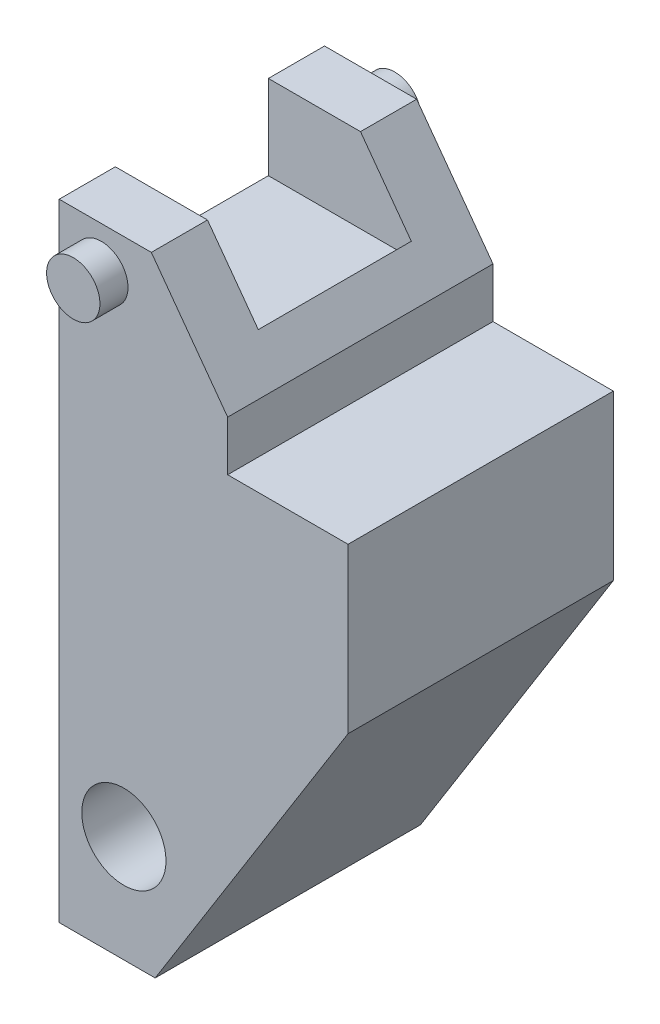
ISO-10303-21;
HEADER;
FILE_DESCRIPTION(('STEP AP214'),'2;1');
FILE_NAME('part.step','',(''),(''),'','','');
FILE_SCHEMA(('AUTOMOTIVE_DESIGN { 1 0 10303 214 1 1 1 1 }'));
ENDSEC;
DATA;
#1=APPLICATION_CONTEXT('core data for automotive mechanical design processes');
#2=APPLICATION_PROTOCOL_DEFINITION('international standard','automotive_design',2000,#1);
#3=PRODUCT_CONTEXT('',#1,'mechanical');
#4=PRODUCT('Part','Part','',(#3));
#5=PRODUCT_RELATED_PRODUCT_CATEGORY('part','',(#4));
#6=PRODUCT_DEFINITION_FORMATION('','',#4);
#7=PRODUCT_DEFINITION_CONTEXT('part definition',#1,'design');
#8=PRODUCT_DEFINITION('design','',#6,#7);
#9=PRODUCT_DEFINITION_SHAPE('','',#8);
#10=(LENGTH_UNIT() NAMED_UNIT(*) SI_UNIT(.MILLI.,.METRE.));
#11=(NAMED_UNIT(*) PLANE_ANGLE_UNIT() SI_UNIT($,.RADIAN.));
#12=(NAMED_UNIT(*) SI_UNIT($,.STERADIAN.) SOLID_ANGLE_UNIT());
#13=UNCERTAINTY_MEASURE_WITH_UNIT(LENGTH_MEASURE(1.E-05),#10,'distance_accuracy_value','');
#14=(GEOMETRIC_REPRESENTATION_CONTEXT(3) GLOBAL_UNCERTAINTY_ASSIGNED_CONTEXT((#13)) GLOBAL_UNIT_ASSIGNED_CONTEXT((#10,
#11,#12)) REPRESENTATION_CONTEXT('',''));
#15=CARTESIAN_POINT('',(0.,0.,0.));
#16=DIRECTION('',(0.,0.,1.));
#17=DIRECTION('',(1.,0.,0.));
#18=AXIS2_PLACEMENT_3D('',#15,#16,#17);
#19=CARTESIAN_POINT('',(3.37816708968153,-9.67384212045168,18.9));
#20=DIRECTION('',(0.,0.,-1.));
#21=DIRECTION('',(-1.,0.,0.));
#22=AXIS2_PLACEMENT_3D('',#19,#20,#21);
#23=CYLINDRICAL_SURFACE('',#22,1.6);
#24=CARTESIAN_POINT('',(3.37816708968153,-9.67384212045168,0.));
#25=DIRECTION('',(0.,0.,1.));
#26=DIRECTION('',(1.,0.,0.));
#27=AXIS2_PLACEMENT_3D('',#24,#25,#26);
#28=CIRCLE('',#27,1.6);
#29=CARTESIAN_POINT('',(4.97816708968153,-9.67384212045168,0.));
#30=VERTEX_POINT('',#29);
#31=EDGE_CURVE('E196',#30,#30,#28,.T.);
#32=ORIENTED_EDGE('',*,*,#31,.F.);
#33=EDGE_LOOP('',(#32));
#34=FACE_BOUND('',#33,.T.);
#35=CARTESIAN_POINT('',(3.37816708968153,-9.67384212045168,12.9));
#36=DIRECTION('',(0.,0.,1.));
#37=DIRECTION('',(1.,0.,0.));
#38=AXIS2_PLACEMENT_3D('',#35,#36,#37);
#39=CIRCLE('',#38,1.6);
#40=CARTESIAN_POINT('',(4.97816708968153,-9.67384212045168,12.9));
#41=VERTEX_POINT('',#40);
#42=EDGE_CURVE('E37',#41,#41,#39,.T.);
#43=ORIENTED_EDGE('',*,*,#42,.T.);
#44=EDGE_LOOP('',(#43));
#45=FACE_BOUND('',#44,.T.);
#46=ADVANCED_FACE('F33',(#34,#45),#23,.F.);
#47=CARTESIAN_POINT('',(8.52526392109153,7.41796568937608,18.9));
#48=DIRECTION('',(0.,0.,-1.));
#49=DIRECTION('',(-1.,0.,0.));
#50=AXIS2_PLACEMENT_3D('',#47,#48,#49);
#51=CYLINDRICAL_SURFACE('',#50,5.1);
#52=CARTESIAN_POINT('',(8.52526392109153,7.41796568937608,0.));
#53=DIRECTION('',(0.,0.,1.));
#54=DIRECTION('',(1.,0.,0.));
#55=AXIS2_PLACEMENT_3D('',#52,#53,#54);
#56=CIRCLE('',#55,5.1);
#57=CARTESIAN_POINT('',(13.6252639210915,7.41796568937608,0.));
#58=VERTEX_POINT('',#57);
#59=EDGE_CURVE('E279',#58,#58,#56,.T.);
#60=ORIENTED_EDGE('',*,*,#59,.F.);
#61=EDGE_LOOP('',(#60));
#62=FACE_BOUND('',#61,.T.);
#63=CARTESIAN_POINT('',(8.52526392109153,7.41796568937608,8.9));
#64=DIRECTION('',(0.,0.,1.));
#65=DIRECTION('',(1.,0.,0.));
#66=AXIS2_PLACEMENT_3D('',#63,#64,#65);
#67=CIRCLE('',#66,5.1);
#68=CARTESIAN_POINT('',(13.6252639210915,7.41796568937608,8.9));
#69=VERTEX_POINT('',#68);
#70=EDGE_CURVE('E219',#69,#69,#67,.T.);
#71=ORIENTED_EDGE('',*,*,#70,.T.);
#72=EDGE_LOOP('',(#71));
#73=FACE_BOUND('',#72,.T.);
#74=ADVANCED_FACE('F298',(#62,#73),#51,.F.);
#75=CARTESIAN_POINT('',(0.,27.3533997750493,0.));
#76=DIRECTION('',(0.,1.,0.));
#77=DIRECTION('',(0.,0.,1.));
#78=AXIS2_PLACEMENT_3D('',#75,#76,#77);
#79=PLANE('',#78);
#80=DIRECTION('',(-1.,0.,0.));
#81=VECTOR('',#80,1.);
#82=CARTESIAN_POINT('',(-1.22842439624783,27.3533997750493,4.));
#83=LINE('',#82,#81);
#84=CARTESIAN_POINT('',(5.33432198728612,27.3533997750493,4.));
#85=VERTEX_POINT('',#84);
#86=CARTESIAN_POINT('',(-1.22842439624783,27.3533997750493,4.));
#87=VERTEX_POINT('',#86);
#88=EDGE_CURVE('E149',#85,#87,#83,.T.);
#89=ORIENTED_EDGE('',*,*,#88,.F.);
#90=DIRECTION('',(0.,0.,1.));
#91=VECTOR('',#90,1.);
#92=CARTESIAN_POINT('',(5.33432198728612,27.3533997750493,0.));
#93=LINE('',#92,#91);
#94=CARTESIAN_POINT('',(5.33432198728612,27.3533997750493,0.));
#95=VERTEX_POINT('',#94);
#96=EDGE_CURVE('E213',#95,#85,#93,.T.);
#97=ORIENTED_EDGE('',*,*,#96,.F.);
#98=DIRECTION('',(-1.,0.,0.));
#99=VECTOR('',#98,1.);
#100=CARTESIAN_POINT('',(-1.22842439624783,27.3533997750493,0.));
#101=LINE('',#100,#99);
#102=CARTESIAN_POINT('',(-1.22842439624783,27.3533997750493,0.));
#103=VERTEX_POINT('',#102);
#104=EDGE_CURVE('E191',#95,#103,#101,.T.);
#105=ORIENTED_EDGE('',*,*,#104,.T.);
#106=DIRECTION('',(0.,0.,1.));
#107=VECTOR('',#106,1.);
#108=CARTESIAN_POINT('',(-1.22842439624783,27.3533997750493,0.));
#109=LINE('',#108,#107);
#110=EDGE_CURVE('E185',#103,#87,#109,.T.);
#111=ORIENTED_EDGE('',*,*,#110,.T.);
#112=EDGE_LOOP('',(#89,#97,#105,#111));
#113=FACE_BOUND('',#112,.T.);
#114=ADVANCED_FACE('F305',(#113),#79,.T.);
#115=CARTESIAN_POINT('',(0.,0.,0.));
#116=DIRECTION('',(0.,0.,1.));
#117=DIRECTION('',(1.,0.,0.));
#118=AXIS2_PLACEMENT_3D('',#115,#116,#117);
#119=PLANE('',#118);
#120=ORIENTED_EDGE('',*,*,#31,.T.);
#121=EDGE_LOOP('',(#120));
#122=FACE_BOUND('',#121,.T.);
#123=ORIENTED_EDGE('',*,*,#104,.F.);
#124=DIRECTION('',(0.589790976494168,-0.807555944839771,0.));
#125=VECTOR('',#124,1.);
#126=CARTESIAN_POINT('',(16.5068891188945,12.05565300401,0.));
#127=LINE('',#126,#125);
#128=CARTESIAN_POINT('',(10.7715756037522,19.9085817690516,0.));
#129=VERTEX_POINT('',#128);
#130=EDGE_CURVE('E58',#95,#129,#127,.T.);
#131=ORIENTED_EDGE('',*,*,#130,.T.);
#132=DIRECTION('',(0.,-1.,0.));
#133=VECTOR('',#132,1.);
#134=CARTESIAN_POINT('',(10.7715756037522,27.3533997750493,0.));
#135=LINE('',#134,#133);
#136=CARTESIAN_POINT('',(10.7715756037522,16.3533997750493,0.));
#137=VERTEX_POINT('',#136);
#138=EDGE_CURVE('E193',#129,#137,#135,.T.);
#139=ORIENTED_EDGE('',*,*,#138,.T.);
#140=DIRECTION('',(-1.,0.,0.));
#141=VECTOR('',#140,1.);
#142=CARTESIAN_POINT('',(-1.22842439624783,16.3533997750493,0.));
#143=LINE('',#142,#141);
#144=CARTESIAN_POINT('',(19.3476842409033,16.3533997750493,0.));
#145=VERTEX_POINT('',#144);
#146=EDGE_CURVE('E269',#145,#137,#143,.T.);
#147=ORIENTED_EDGE('',*,*,#146,.F.);
#148=DIRECTION('',(0.,1.,0.));
#149=VECTOR('',#148,1.);
#150=CARTESIAN_POINT('',(19.3476842409033,16.3533997750493,0.));
#151=LINE('',#150,#149);
#152=CARTESIAN_POINT('',(19.3476842409033,4.66607576400252,0.));
#153=VERTEX_POINT('',#152);
#154=EDGE_CURVE('E272',#153,#145,#151,.T.);
#155=ORIENTED_EDGE('',*,*,#154,.F.);
#156=DIRECTION('',(-0.530772678386404,-0.847514226357601,0.));
#157=VECTOR('',#156,1.);
#158=CARTESIAN_POINT('',(11.7980863060379,-7.38878672916514,0.));
#159=LINE('',#158,#157);
#160=CARTESIAN_POINT('',(5.60682473883522,-17.2747180722351,0.));
#161=VERTEX_POINT('',#160);
#162=EDGE_CURVE('E172',#153,#161,#159,.T.);
#163=ORIENTED_EDGE('',*,*,#162,.T.);
#164=DIRECTION('',(1.,0.,0.));
#165=VECTOR('',#164,1.);
#166=CARTESIAN_POINT('',(-1.22842439624783,-17.2747180722351,0.));
#167=LINE('',#166,#165);
#168=CARTESIAN_POINT('',(-1.22842439624783,-17.2747180722351,0.));
#169=VERTEX_POINT('',#168);
#170=EDGE_CURVE('E276',#169,#161,#167,.T.);
#171=ORIENTED_EDGE('',*,*,#170,.F.);
#172=DIRECTION('',(0.,-1.,0.));
#173=VECTOR('',#172,1.);
#174=CARTESIAN_POINT('',(-1.22842439624783,16.3533997750493,0.));
#175=LINE('',#174,#173);
#176=EDGE_CURVE('E278',#103,#169,#175,.T.);
#177=ORIENTED_EDGE('',*,*,#176,.F.);
#178=EDGE_LOOP('',(#123,#131,#139,#147,#155,#163,#171,#177));
#179=FACE_BOUND('',#178,.T.);
#180=ORIENTED_EDGE('',*,*,#59,.T.);
#181=EDGE_LOOP('',(#180));
#182=FACE_BOUND('',#181,.T.);
#183=CARTESIAN_POINT('',(1.77157560375217,24.3533997750493,0.));
#184=DIRECTION('',(0.,0.,1.));
#185=DIRECTION('',(1.,0.,0.));
#186=AXIS2_PLACEMENT_3D('',#183,#184,#185);
#187=CIRCLE('',#186,1.9);
#188=CARTESIAN_POINT('',(3.67157560375217,24.3533997750493,0.));
#189=VERTEX_POINT('',#188);
#190=EDGE_CURVE('E251',#189,#189,#187,.F.);
#191=ORIENTED_EDGE('',*,*,#190,.F.);
#192=EDGE_LOOP('',(#191));
#193=FACE_BOUND('',#192,.T.);
#194=ADVANCED_FACE('F294',(#122,#179,#182,#193),#119,.F.);
#195=CARTESIAN_POINT('',(0.,0.,18.9));
#196=DIRECTION('',(0.,0.,1.));
#197=DIRECTION('',(1.,0.,0.));
#198=AXIS2_PLACEMENT_3D('',#195,#196,#197);
#199=PLANE('',#198);
#200=CARTESIAN_POINT('',(3.37816708968153,-9.67384212045168,18.9));
#201=DIRECTION('',(0.,0.,1.));
#202=DIRECTION('',(1.,0.,0.));
#203=AXIS2_PLACEMENT_3D('',#200,#201,#202);
#204=CIRCLE('',#203,3.);
#205=CARTESIAN_POINT('',(6.37816708968153,-9.67384212045168,18.9));
#206=VERTEX_POINT('',#205);
#207=EDGE_CURVE('E229',#206,#206,#204,.T.);
#208=ORIENTED_EDGE('',*,*,#207,.F.);
#209=EDGE_LOOP('',(#208));
#210=FACE_BOUND('',#209,.T.);
#211=DIRECTION('',(0.589790976494168,-0.807555944839771,0.));
#212=VECTOR('',#211,1.);
#213=CARTESIAN_POINT('',(5.33432198728612,27.3533997750493,18.9));
#214=LINE('',#213,#212);
#215=CARTESIAN_POINT('',(5.33432198728612,27.3533997750493,18.9));
#216=VERTEX_POINT('',#215);
#217=CARTESIAN_POINT('',(10.7715756037522,19.9085817690516,18.9));
#218=VERTEX_POINT('',#217);
#219=EDGE_CURVE('E160',#216,#218,#214,.T.);
#220=ORIENTED_EDGE('',*,*,#219,.F.);
#221=DIRECTION('',(1.,0.,0.));
#222=VECTOR('',#221,1.);
#223=CARTESIAN_POINT('',(-1.22842439624783,27.3533997750493,18.9));
#224=LINE('',#223,#222);
#225=CARTESIAN_POINT('',(-1.22842439624783,27.3533997750493,18.9));
#226=VERTEX_POINT('',#225);
#227=EDGE_CURVE('E188',#226,#216,#224,.T.);
#228=ORIENTED_EDGE('',*,*,#227,.F.);
#229=DIRECTION('',(0.,-1.,0.));
#230=VECTOR('',#229,1.);
#231=CARTESIAN_POINT('',(-1.22842439624783,16.3533997750493,18.9));
#232=LINE('',#231,#230);
#233=CARTESIAN_POINT('',(-1.22842439624783,-17.2747180722351,18.9));
#234=VERTEX_POINT('',#233);
#235=EDGE_CURVE('E271',#226,#234,#232,.T.);
#236=ORIENTED_EDGE('',*,*,#235,.T.);
#237=DIRECTION('',(1.,0.,0.));
#238=VECTOR('',#237,1.);
#239=CARTESIAN_POINT('',(-1.22842439624783,-17.2747180722351,18.9));
#240=LINE('',#239,#238);
#241=CARTESIAN_POINT('',(5.60682473883522,-17.2747180722351,18.9));
#242=VERTEX_POINT('',#241);
#243=EDGE_CURVE('E284',#234,#242,#240,.T.);
#244=ORIENTED_EDGE('',*,*,#243,.T.);
#245=DIRECTION('',(-0.530772678386404,-0.847514226357601,0.));
#246=VECTOR('',#245,1.);
#247=CARTESIAN_POINT('',(5.60682473883522,-17.2747180722351,18.9));
#248=LINE('',#247,#246);
#249=CARTESIAN_POINT('',(19.3476842409033,4.66607576400252,18.9));
#250=VERTEX_POINT('',#249);
#251=EDGE_CURVE('E167',#250,#242,#248,.T.);
#252=ORIENTED_EDGE('',*,*,#251,.F.);
#253=DIRECTION('',(0.,1.,0.));
#254=VECTOR('',#253,1.);
#255=CARTESIAN_POINT('',(19.3476842409033,16.3533997750493,18.9));
#256=LINE('',#255,#254);
#257=CARTESIAN_POINT('',(19.3476842409033,16.3533997750493,18.9));
#258=VERTEX_POINT('',#257);
#259=EDGE_CURVE('E282',#250,#258,#256,.T.);
#260=ORIENTED_EDGE('',*,*,#259,.T.);
#261=DIRECTION('',(-1.,0.,0.));
#262=VECTOR('',#261,1.);
#263=CARTESIAN_POINT('',(-1.22842439624783,16.3533997750493,18.9));
#264=LINE('',#263,#262);
#265=CARTESIAN_POINT('',(10.7715756037522,16.3533997750493,18.9));
#266=VERTEX_POINT('',#265);
#267=EDGE_CURVE('E202',#258,#266,#264,.T.);
#268=ORIENTED_EDGE('',*,*,#267,.T.);
#269=DIRECTION('',(0.,-1.,0.));
#270=VECTOR('',#269,1.);
#271=CARTESIAN_POINT('',(10.7715756037522,27.3533997750493,18.9));
#272=LINE('',#271,#270);
#273=EDGE_CURVE('E212',#218,#266,#272,.T.);
#274=ORIENTED_EDGE('',*,*,#273,.F.);
#275=EDGE_LOOP('',(#220,#228,#236,#244,#252,#260,#268,#274));
#276=FACE_BOUND('',#275,.T.);
#277=CARTESIAN_POINT('',(1.77157560375217,24.3533997750493,18.9));
#278=DIRECTION('',(0.,0.,1.));
#279=DIRECTION('',(1.,0.,0.));
#280=AXIS2_PLACEMENT_3D('',#277,#278,#279);
#281=CIRCLE('',#280,1.9);
#282=CARTESIAN_POINT('',(3.67157560375217,24.3533997750493,18.9));
#283=VERTEX_POINT('',#282);
#284=EDGE_CURVE('E178',#283,#283,#281,.T.);
#285=ORIENTED_EDGE('',*,*,#284,.F.);
#286=EDGE_LOOP('',(#285));
#287=FACE_BOUND('',#286,.T.);
#288=ADVANCED_FACE('F312',(#210,#276,#287),#199,.T.);
#289=CARTESIAN_POINT('',(-1.22842439624783,16.3533997750493,18.9));
#290=DIRECTION('',(0.,-1.,0.));
#291=DIRECTION('',(0.,0.,-1.));
#292=AXIS2_PLACEMENT_3D('',#289,#290,#291);
#293=PLANE('',#292);
#294=DIRECTION('',(0.,0.,-1.));
#295=VECTOR('',#294,1.);
#296=CARTESIAN_POINT('',(10.7715756037522,16.3533997750493,0.));
#297=LINE('',#296,#295);
#298=EDGE_CURVE('E182',#266,#137,#297,.T.);
#299=ORIENTED_EDGE('',*,*,#298,.F.);
#300=ORIENTED_EDGE('',*,*,#267,.F.);
#301=DIRECTION('',(0.,0.,-1.));
#302=VECTOR('',#301,1.);
#303=CARTESIAN_POINT('',(19.3476842409033,16.3533997750493,18.9));
#304=LINE('',#303,#302);
#305=EDGE_CURVE('E260',#258,#145,#304,.T.);
#306=ORIENTED_EDGE('',*,*,#305,.T.);
#307=ORIENTED_EDGE('',*,*,#146,.T.);
#308=EDGE_LOOP('',(#299,#300,#306,#307));
#309=FACE_BOUND('',#308,.T.);
#310=ADVANCED_FACE('F314',(#309),#293,.F.);
#311=CARTESIAN_POINT('',(-1.22842439624783,16.3533997750493,18.9));
#312=DIRECTION('',(1.,0.,0.));
#313=DIRECTION('',(0.,0.,-1.));
#314=AXIS2_PLACEMENT_3D('',#311,#312,#313);
#315=PLANE('',#314);
#316=DIRECTION('',(0.,0.,1.));
#317=VECTOR('',#316,1.);
#318=CARTESIAN_POINT('',(-1.22842439624783,21.3533997750493,14.9));
#319=LINE('',#318,#317);
#320=CARTESIAN_POINT('',(-1.22842439624783,21.3533997750493,4.));
#321=VERTEX_POINT('',#320);
#322=CARTESIAN_POINT('',(-1.22842439624783,21.3533997750493,14.9));
#323=VERTEX_POINT('',#322);
#324=EDGE_CURVE('E140',#321,#323,#319,.T.);
#325=ORIENTED_EDGE('',*,*,#324,.F.);
#326=DIRECTION('',(0.,1.,0.));
#327=VECTOR('',#326,1.);
#328=CARTESIAN_POINT('',(-1.22842439624783,21.3533997750493,4.));
#329=LINE('',#328,#327);
#330=EDGE_CURVE('E163',#321,#87,#329,.T.);
#331=ORIENTED_EDGE('',*,*,#330,.T.);
#332=ORIENTED_EDGE('',*,*,#110,.F.);
#333=ORIENTED_EDGE('',*,*,#176,.T.);
#334=DIRECTION('',(0.,0.,-1.));
#335=VECTOR('',#334,1.);
#336=CARTESIAN_POINT('',(-1.22842439624783,-17.2747180722351,18.9));
#337=LINE('',#336,#335);
#338=EDGE_CURVE('E256',#234,#169,#337,.T.);
#339=ORIENTED_EDGE('',*,*,#338,.F.);
#340=ORIENTED_EDGE('',*,*,#235,.F.);
#341=CARTESIAN_POINT('',(-1.22842439624783,27.3533997750493,14.9));
#342=VERTEX_POINT('',#341);
#343=EDGE_CURVE('E153',#342,#226,#109,.T.);
#344=ORIENTED_EDGE('',*,*,#343,.F.);
#345=DIRECTION('',(0.,1.,0.));
#346=VECTOR('',#345,1.);
#347=CARTESIAN_POINT('',(-1.22842439624783,21.3533997750493,14.9));
#348=LINE('',#347,#346);
#349=EDGE_CURVE('E133',#323,#342,#348,.T.);
#350=ORIENTED_EDGE('',*,*,#349,.F.);
#351=EDGE_LOOP('',(#325,#331,#332,#333,#339,#340,#344,#350));
#352=FACE_BOUND('',#351,.T.);
#353=ADVANCED_FACE('F35',(#352),#315,.F.);
#354=CARTESIAN_POINT('',(-1.22842439624783,-17.2747180722351,18.9));
#355=DIRECTION('',(0.,1.,0.));
#356=DIRECTION('',(0.,0.,1.));
#357=AXIS2_PLACEMENT_3D('',#354,#355,#356);
#358=PLANE('',#357);
#359=ORIENTED_EDGE('',*,*,#170,.T.);
#360=DIRECTION('',(0.,0.,1.));
#361=VECTOR('',#360,1.);
#362=CARTESIAN_POINT('',(5.60682473883522,-17.2747180722351,-2.));
#363=LINE('',#362,#361);
#364=EDGE_CURVE('E169',#161,#242,#363,.T.);
#365=ORIENTED_EDGE('',*,*,#364,.T.);
#366=ORIENTED_EDGE('',*,*,#243,.F.);
#367=ORIENTED_EDGE('',*,*,#338,.T.);
#368=EDGE_LOOP('',(#359,#365,#366,#367));
#369=FACE_BOUND('',#368,.T.);
#370=ADVANCED_FACE('F323',(#369),#358,.F.);
#371=CARTESIAN_POINT('',(19.3476842409033,16.3533997750493,18.9));
#372=DIRECTION('',(-1.,0.,0.));
#373=DIRECTION('',(0.,0.,1.));
#374=AXIS2_PLACEMENT_3D('',#371,#372,#373);
#375=PLANE('',#374);
#376=ORIENTED_EDGE('',*,*,#259,.F.);
#377=DIRECTION('',(0.,0.,-1.));
#378=VECTOR('',#377,1.);
#379=CARTESIAN_POINT('',(19.3476842409033,4.66607576400252,18.9));
#380=LINE('',#379,#378);
#381=EDGE_CURVE('E247',#250,#153,#380,.T.);
#382=ORIENTED_EDGE('',*,*,#381,.T.);
#383=ORIENTED_EDGE('',*,*,#154,.T.);
#384=ORIENTED_EDGE('',*,*,#305,.F.);
#385=EDGE_LOOP('',(#376,#382,#383,#384));
#386=FACE_BOUND('',#385,.T.);
#387=ADVANCED_FACE('F321',(#386),#375,.F.);
#388=CARTESIAN_POINT('',(10.7715756037522,27.3533997750493,0.));
#389=DIRECTION('',(-1.,0.,0.));
#390=DIRECTION('',(0.,0.,1.));
#391=AXIS2_PLACEMENT_3D('',#388,#389,#390);
#392=PLANE('',#391);
#393=ORIENTED_EDGE('',*,*,#138,.F.);
#394=DIRECTION('',(0.,0.,1.));
#395=VECTOR('',#394,1.);
#396=CARTESIAN_POINT('',(10.7715756037522,19.9085817690516,-2.));
#397=LINE('',#396,#395);
#398=EDGE_CURVE('E162',#129,#218,#397,.T.);
#399=ORIENTED_EDGE('',*,*,#398,.T.);
#400=ORIENTED_EDGE('',*,*,#273,.T.);
#401=ORIENTED_EDGE('',*,*,#298,.T.);
#402=EDGE_LOOP('',(#393,#399,#400,#401));
#403=FACE_BOUND('',#402,.T.);
#404=ADVANCED_FACE('F309',(#403),#392,.F.);
#405=DIRECTION('',(1.,0.,0.));
#406=VECTOR('',#405,1.);
#407=CARTESIAN_POINT('',(-1.22842439624783,27.3533997750493,14.9));
#408=LINE('',#407,#406);
#409=CARTESIAN_POINT('',(5.33432198728612,27.3533997750493,14.9));
#410=VERTEX_POINT('',#409);
#411=EDGE_CURVE('E50',#342,#410,#408,.T.);
#412=ORIENTED_EDGE('',*,*,#411,.F.);
#413=ORIENTED_EDGE('',*,*,#343,.T.);
#414=ORIENTED_EDGE('',*,*,#227,.T.);
#415=EDGE_CURVE('E246',#410,#216,#93,.T.);
#416=ORIENTED_EDGE('',*,*,#415,.F.);
#417=EDGE_LOOP('',(#412,#413,#414,#416));
#418=FACE_BOUND('',#417,.T.);
#419=ADVANCED_FACE('F345',(#418),#79,.T.);
#420=CARTESIAN_POINT('',(1.77157560375217,24.3533997750493,20.9));
#421=DIRECTION('',(0.,0.,-1.));
#422=DIRECTION('',(-1.,0.,0.));
#423=AXIS2_PLACEMENT_3D('',#420,#421,#422);
#424=CYLINDRICAL_SURFACE('',#423,1.9);
#425=CARTESIAN_POINT('',(1.77157560375217,24.3533997750493,20.9));
#426=DIRECTION('',(0.,0.,1.));
#427=DIRECTION('',(1.,0.,0.));
#428=AXIS2_PLACEMENT_3D('',#425,#426,#427);
#429=CIRCLE('',#428,1.9);
#430=CARTESIAN_POINT('',(3.67157560375217,24.3533997750493,20.9));
#431=VERTEX_POINT('',#430);
#432=EDGE_CURVE('E179',#431,#431,#429,.T.);
#433=ORIENTED_EDGE('',*,*,#432,.F.);
#434=EDGE_LOOP('',(#433));
#435=FACE_BOUND('',#434,.T.);
#436=ORIENTED_EDGE('',*,*,#284,.T.);
#437=EDGE_LOOP('',(#436));
#438=FACE_BOUND('',#437,.T.);
#439=ADVANCED_FACE('F347',(#435,#438),#424,.T.);
#440=CARTESIAN_POINT('',(1.77157560375217,24.3533997750493,20.9));
#441=DIRECTION('',(0.,0.,1.));
#442=DIRECTION('',(1.,0.,0.));
#443=AXIS2_PLACEMENT_3D('',#440,#441,#442);
#444=PLANE('',#443);
#445=ORIENTED_EDGE('',*,*,#432,.T.);
#446=EDGE_LOOP('',(#445));
#447=FACE_BOUND('',#446,.T.);
#448=ADVANCED_FACE('F352',(#447),#444,.T.);
#449=CARTESIAN_POINT('',(1.77157560375217,24.3533997750493,-2.));
#450=DIRECTION('',(0.,0.,1.));
#451=DIRECTION('',(1.,0.,0.));
#452=AXIS2_PLACEMENT_3D('',#449,#450,#451);
#453=CYLINDRICAL_SURFACE('',#452,1.9);
#454=CARTESIAN_POINT('',(1.77157560375217,24.3533997750493,-2.));
#455=DIRECTION('',(0.,0.,-1.));
#456=DIRECTION('',(-1.,0.,0.));
#457=AXIS2_PLACEMENT_3D('',#454,#455,#456);
#458=CIRCLE('',#457,1.9);
#459=CARTESIAN_POINT('',(-0.128424396247831,24.3533997750493,-2.));
#460=VERTEX_POINT('',#459);
#461=EDGE_CURVE('E175',#460,#460,#458,.T.);
#462=ORIENTED_EDGE('',*,*,#461,.F.);
#463=EDGE_LOOP('',(#462));
#464=FACE_BOUND('',#463,.T.);
#465=ORIENTED_EDGE('',*,*,#190,.T.);
#466=EDGE_LOOP('',(#465));
#467=FACE_BOUND('',#466,.T.);
#468=ADVANCED_FACE('F478',(#464,#467),#453,.T.);
#469=CARTESIAN_POINT('',(1.77157560375217,24.3533997750493,-2.));
#470=DIRECTION('',(0.,0.,-1.));
#471=DIRECTION('',(-1.,0.,0.));
#472=AXIS2_PLACEMENT_3D('',#469,#470,#471);
#473=PLANE('',#472);
#474=ORIENTED_EDGE('',*,*,#461,.T.);
#475=EDGE_LOOP('',(#474));
#476=FACE_BOUND('',#475,.T.);
#477=ADVANCED_FACE('F475',(#476),#473,.T.);
#478=CARTESIAN_POINT('',(5.60682473883522,-17.2747180722351,-2.));
#479=DIRECTION('',(-0.847514226357601,0.530772678386404,0.));
#480=DIRECTION('',(-0.530772678386404,-0.847514226357601,0.));
#481=AXIS2_PLACEMENT_3D('',#478,#479,#480);
#482=PLANE('',#481);
#483=ORIENTED_EDGE('',*,*,#381,.F.);
#484=ORIENTED_EDGE('',*,*,#251,.T.);
#485=ORIENTED_EDGE('',*,*,#364,.F.);
#486=ORIENTED_EDGE('',*,*,#162,.F.);
#487=EDGE_LOOP('',(#483,#484,#485,#486));
#488=FACE_BOUND('',#487,.T.);
#489=ADVANCED_FACE('F332',(#488),#482,.F.);
#490=CARTESIAN_POINT('',(5.33432198728612,27.3533997750493,-2.));
#491=DIRECTION('',(-0.807555944839771,-0.589790976494168,0.));
#492=DIRECTION('',(0.589790976494168,-0.807555944839771,0.));
#493=AXIS2_PLACEMENT_3D('',#490,#491,#492);
#494=PLANE('',#493);
#495=ORIENTED_EDGE('',*,*,#96,.T.);
#496=DIRECTION('',(0.589790976494168,-0.807555944839771,0.));
#497=VECTOR('',#496,1.);
#498=CARTESIAN_POINT('',(5.33432198728612,27.3533997750493,4.));
#499=LINE('',#498,#497);
#500=CARTESIAN_POINT('',(8.95314568552408,22.3984196086682,4.));
#501=VERTEX_POINT('',#500);
#502=EDGE_CURVE('E11',#85,#501,#499,.T.);
#503=ORIENTED_EDGE('',*,*,#502,.T.);
#504=DIRECTION('',(0.,0.,1.));
#505=VECTOR('',#504,1.);
#506=CARTESIAN_POINT('',(8.95314568552408,22.3984196086682,-2.));
#507=LINE('',#506,#505);
#508=CARTESIAN_POINT('',(8.95314568552408,22.3984196086682,14.9));
#509=VERTEX_POINT('',#508);
#510=EDGE_CURVE('E42',#501,#509,#507,.T.);
#511=ORIENTED_EDGE('',*,*,#510,.T.);
#512=DIRECTION('',(-0.589790976494168,0.807555944839771,0.));
#513=VECTOR('',#512,1.);
#514=CARTESIAN_POINT('',(5.33432198728612,27.3533997750493,14.9));
#515=LINE('',#514,#513);
#516=EDGE_CURVE('E216',#509,#410,#515,.T.);
#517=ORIENTED_EDGE('',*,*,#516,.T.);
#518=ORIENTED_EDGE('',*,*,#415,.T.);
#519=ORIENTED_EDGE('',*,*,#219,.T.);
#520=ORIENTED_EDGE('',*,*,#398,.F.);
#521=ORIENTED_EDGE('',*,*,#130,.F.);
#522=EDGE_LOOP('',(#495,#503,#511,#517,#518,#519,#520,#521));
#523=FACE_BOUND('',#522,.T.);
#524=ADVANCED_FACE('F243',(#523),#494,.F.);
#525=CARTESIAN_POINT('',(-1.22842439624783,21.3533997750493,4.));
#526=DIRECTION('',(0.,0.,-1.));
#527=DIRECTION('',(-1.,0.,0.));
#528=AXIS2_PLACEMENT_3D('',#525,#526,#527);
#529=PLANE('',#528);
#530=ORIENTED_EDGE('',*,*,#88,.T.);
#531=ORIENTED_EDGE('',*,*,#330,.F.);
#532=DIRECTION('',(-1.,0.,0.));
#533=VECTOR('',#532,1.);
#534=CARTESIAN_POINT('',(-1.22842439624783,21.3533997750493,4.));
#535=LINE('',#534,#533);
#536=CARTESIAN_POINT('',(8.95314568552408,21.3533997750493,4.));
#537=VERTEX_POINT('',#536);
#538=EDGE_CURVE('E146',#537,#321,#535,.T.);
#539=ORIENTED_EDGE('',*,*,#538,.F.);
#540=DIRECTION('',(0.,1.,0.));
#541=VECTOR('',#540,1.);
#542=CARTESIAN_POINT('',(8.95314568552408,21.3533997750493,4.));
#543=LINE('',#542,#541);
#544=EDGE_CURVE('E155',#537,#501,#543,.T.);
#545=ORIENTED_EDGE('',*,*,#544,.T.);
#546=ORIENTED_EDGE('',*,*,#502,.F.);
#547=EDGE_LOOP('',(#530,#531,#539,#545,#546));
#548=FACE_BOUND('',#547,.T.);
#549=ADVANCED_FACE('F240',(#548),#529,.F.);
#550=CARTESIAN_POINT('',(8.95314568552408,21.3533997750493,14.9));
#551=DIRECTION('',(1.,0.,0.));
#552=DIRECTION('',(0.,0.,-1.));
#553=AXIS2_PLACEMENT_3D('',#550,#551,#552);
#554=PLANE('',#553);
#555=ORIENTED_EDGE('',*,*,#544,.F.);
#556=DIRECTION('',(0.,0.,-1.));
#557=VECTOR('',#556,1.);
#558=CARTESIAN_POINT('',(8.95314568552408,21.3533997750493,14.9));
#559=LINE('',#558,#557);
#560=CARTESIAN_POINT('',(8.95314568552408,21.3533997750493,14.9));
#561=VERTEX_POINT('',#560);
#562=EDGE_CURVE('E139',#561,#537,#559,.T.);
#563=ORIENTED_EDGE('',*,*,#562,.F.);
#564=DIRECTION('',(0.,1.,0.));
#565=VECTOR('',#564,1.);
#566=CARTESIAN_POINT('',(8.95314568552408,21.3533997750493,14.9));
#567=LINE('',#566,#565);
#568=EDGE_CURVE('E135',#561,#509,#567,.T.);
#569=ORIENTED_EDGE('',*,*,#568,.T.);
#570=ORIENTED_EDGE('',*,*,#510,.F.);
#571=EDGE_LOOP('',(#555,#563,#569,#570));
#572=FACE_BOUND('',#571,.T.);
#573=ADVANCED_FACE('F411',(#572),#554,.F.);
#574=CARTESIAN_POINT('',(-1.22842439624783,21.3533997750493,14.9));
#575=DIRECTION('',(0.,0.,1.));
#576=DIRECTION('',(1.,0.,0.));
#577=AXIS2_PLACEMENT_3D('',#574,#575,#576);
#578=PLANE('',#577);
#579=ORIENTED_EDGE('',*,*,#568,.F.);
#580=DIRECTION('',(1.,0.,0.));
#581=VECTOR('',#580,1.);
#582=CARTESIAN_POINT('',(-1.22842439624783,21.3533997750493,14.9));
#583=LINE('',#582,#581);
#584=EDGE_CURVE('E129',#323,#561,#583,.T.);
#585=ORIENTED_EDGE('',*,*,#584,.F.);
#586=ORIENTED_EDGE('',*,*,#349,.T.);
#587=ORIENTED_EDGE('',*,*,#411,.T.);
#588=ORIENTED_EDGE('',*,*,#516,.F.);
#589=EDGE_LOOP('',(#579,#585,#586,#587,#588));
#590=FACE_BOUND('',#589,.T.);
#591=ADVANCED_FACE('F131',(#590),#578,.F.);
#592=CARTESIAN_POINT('',(0.,21.3533997750493,0.));
#593=DIRECTION('',(0.,-1.,0.));
#594=DIRECTION('',(0.,0.,-1.));
#595=AXIS2_PLACEMENT_3D('',#592,#593,#594);
#596=PLANE('',#595);
#597=ORIENTED_EDGE('',*,*,#324,.T.);
#598=ORIENTED_EDGE('',*,*,#584,.T.);
#599=ORIENTED_EDGE('',*,*,#562,.T.);
#600=ORIENTED_EDGE('',*,*,#538,.T.);
#601=EDGE_LOOP('',(#597,#598,#599,#600));
#602=FACE_BOUND('',#601,.T.);
#603=ADVANCED_FACE('F144',(#602),#596,.F.);
#604=CARTESIAN_POINT('',(8.52526392109153,7.41796568937608,8.9));
#605=DIRECTION('',(0.,0.,1.));
#606=DIRECTION('',(1.,0.,0.));
#607=AXIS2_PLACEMENT_3D('',#604,#605,#606);
#608=PLANE('',#607);
#609=ORIENTED_EDGE('',*,*,#70,.F.);
#610=EDGE_LOOP('',(#609));
#611=FACE_BOUND('',#610,.T.);
#612=ADVANCED_FACE('F435',(#611),#608,.F.);
#613=CARTESIAN_POINT('',(3.37816708968153,-9.67384212045168,12.9));
#614=DIRECTION('',(0.,0.,1.));
#615=DIRECTION('',(1.,0.,0.));
#616=AXIS2_PLACEMENT_3D('',#613,#614,#615);
#617=CYLINDRICAL_SURFACE('',#616,3.);
#618=CARTESIAN_POINT('',(3.37816708968153,-9.67384212045168,12.9));
#619=DIRECTION('',(0.,0.,1.));
#620=DIRECTION('',(1.,0.,0.));
#621=AXIS2_PLACEMENT_3D('',#618,#619,#620);
#622=CIRCLE('',#621,3.);
#623=CARTESIAN_POINT('',(6.37816708968153,-9.67384212045168,12.9));
#624=VERTEX_POINT('',#623);
#625=EDGE_CURVE('E225',#624,#624,#622,.T.);
#626=ORIENTED_EDGE('',*,*,#625,.F.);
#627=EDGE_LOOP('',(#626));
#628=FACE_BOUND('',#627,.T.);
#629=ORIENTED_EDGE('',*,*,#207,.T.);
#630=EDGE_LOOP('',(#629));
#631=FACE_BOUND('',#630,.T.);
#632=ADVANCED_FACE('F445',(#628,#631),#617,.F.);
#633=CARTESIAN_POINT('',(3.37816708968153,-9.67384212045168,12.9));
#634=DIRECTION('',(0.,0.,1.));
#635=DIRECTION('',(1.,0.,0.));
#636=AXIS2_PLACEMENT_3D('',#633,#634,#635);
#637=PLANE('',#636);
#638=ORIENTED_EDGE('',*,*,#42,.F.);
#639=EDGE_LOOP('',(#638));
#640=FACE_BOUND('',#639,.T.);
#641=ORIENTED_EDGE('',*,*,#625,.T.);
#642=EDGE_LOOP('',(#641));
#643=FACE_BOUND('',#642,.T.);
#644=ADVANCED_FACE('F459',(#640,#643),#637,.T.);
#645=CLOSED_SHELL('',(#46,#74,#114,#194,#288,#310,#353,#370,#387,#404,#419,#439,#448,#468,#477,
#489,#524,#549,#573,#591,#603,#612,#632,#644));
#646=MANIFOLD_SOLID_BREP('B2',#645);
#647=ADVANCED_BREP_SHAPE_REPRESENTATION('',(#18,#646),#14);
#648=SHAPE_DEFINITION_REPRESENTATION(#9,#647);
ENDSEC;
END-ISO-10303-21;
